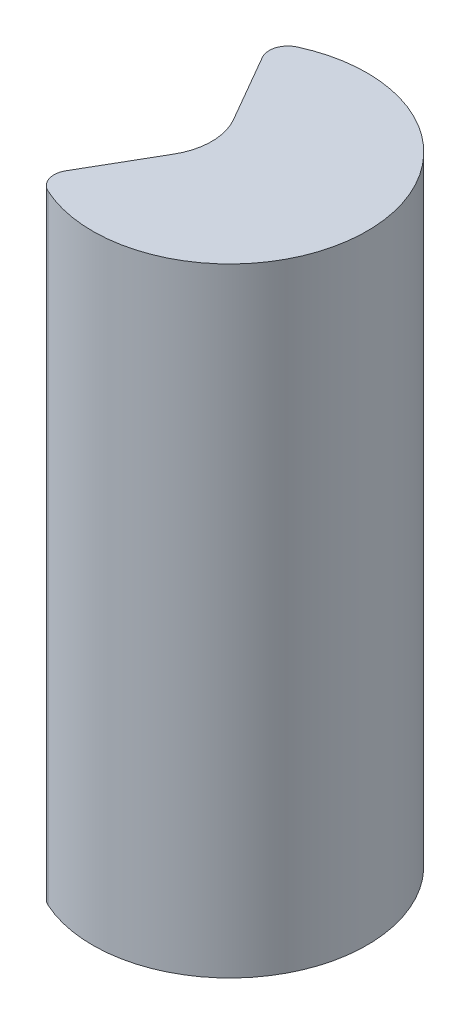
ISO-10303-21;
HEADER;
FILE_DESCRIPTION(('STEP AP214'),'2;1');
FILE_NAME('part.step','',(''),(''),'','','');
FILE_SCHEMA(('AUTOMOTIVE_DESIGN { 1 0 10303 214 1 1 1 1 }'));
ENDSEC;
DATA;
#1=APPLICATION_CONTEXT('core data for automotive mechanical design processes');
#2=APPLICATION_PROTOCOL_DEFINITION('international standard','automotive_design',2000,#1);
#3=PRODUCT_CONTEXT('',#1,'mechanical');
#4=PRODUCT('Part','Part','',(#3));
#5=PRODUCT_RELATED_PRODUCT_CATEGORY('part','',(#4));
#6=PRODUCT_DEFINITION_FORMATION('','',#4);
#7=PRODUCT_DEFINITION_CONTEXT('part definition',#1,'design');
#8=PRODUCT_DEFINITION('design','',#6,#7);
#9=PRODUCT_DEFINITION_SHAPE('','',#8);
#10=(LENGTH_UNIT() NAMED_UNIT(*) SI_UNIT(.MILLI.,.METRE.));
#11=(NAMED_UNIT(*) PLANE_ANGLE_UNIT() SI_UNIT($,.RADIAN.));
#12=(NAMED_UNIT(*) SI_UNIT($,.STERADIAN.) SOLID_ANGLE_UNIT());
#13=UNCERTAINTY_MEASURE_WITH_UNIT(LENGTH_MEASURE(1.E-05),#10,'distance_accuracy_value','');
#14=(GEOMETRIC_REPRESENTATION_CONTEXT(3) GLOBAL_UNCERTAINTY_ASSIGNED_CONTEXT((#13)) GLOBAL_UNIT_ASSIGNED_CONTEXT((#10,
#11,#12)) REPRESENTATION_CONTEXT('',''));
#15=CARTESIAN_POINT('',(0.,0.,0.));
#16=DIRECTION('',(0.,0.,1.));
#17=DIRECTION('',(1.,0.,0.));
#18=AXIS2_PLACEMENT_3D('',#15,#16,#17);
#19=CARTESIAN_POINT('',(-26.3951233930314,330.,57.4241888150511));
#20=DIRECTION('',(0.,-1.,0.));
#21=DIRECTION('',(0.,0.,-1.));
#22=AXIS2_PLACEMENT_3D('',#19,#20,#21);
#23=CYLINDRICAL_SURFACE('',#22,10.);
#24=CARTESIAN_POINT('',(-26.3951233930314,0.,57.4241888150511));
#25=DIRECTION('',(0.,1.,0.));
#26=DIRECTION('',(0.,0.,-1.));
#27=AXIS2_PLACEMENT_3D('',#24,#25,#26);
#28=CIRCLE('',#27,10.);
#29=CARTESIAN_POINT('',(-35.0553774308759,0.,52.4241888150512));
#30=VERTEX_POINT('',#29);
#31=CARTESIAN_POINT('',(-30.5715669678782,0.,66.5102946402175));
#32=VERTEX_POINT('',#31);
#33=EDGE_CURVE('E128',#30,#32,#28,.T.);
#34=ORIENTED_EDGE('',*,*,#33,.T.);
#35=DIRECTION('',(0.,-1.,0.));
#36=VECTOR('',#35,1.);
#37=CARTESIAN_POINT('',(-30.5715669678782,330.,66.5102946402175));
#38=LINE('',#37,#36);
#39=CARTESIAN_POINT('',(-30.5715669678782,330.,66.5102946402175));
#40=VERTEX_POINT('',#39);
#41=EDGE_CURVE('E11',#40,#32,#38,.T.);
#42=ORIENTED_EDGE('',*,*,#41,.F.);
#43=CARTESIAN_POINT('',(-26.3951233930314,330.,57.4241888150511));
#44=DIRECTION('',(0.,1.,0.));
#45=DIRECTION('',(0.,0.,-1.));
#46=AXIS2_PLACEMENT_3D('',#43,#44,#45);
#47=CIRCLE('',#46,10.);
#48=CARTESIAN_POINT('',(-35.0553774308759,330.,52.4241888150512));
#49=VERTEX_POINT('',#48);
#50=EDGE_CURVE('E144',#49,#40,#47,.T.);
#51=ORIENTED_EDGE('',*,*,#50,.F.);
#52=DIRECTION('',(0.,-1.,0.));
#53=VECTOR('',#52,1.);
#54=CARTESIAN_POINT('',(-35.0553774308759,330.,52.4241888150512));
#55=LINE('',#54,#53);
#56=EDGE_CURVE('E124',#49,#30,#55,.T.);
#57=ORIENTED_EDGE('',*,*,#56,.T.);
#58=EDGE_LOOP('',(#34,#42,#51,#57));
#59=FACE_BOUND('',#58,.T.);
#60=ADVANCED_FACE('F39',(#59),#23,.T.);
#61=CARTESIAN_POINT('',(0.,330.,0.));
#62=DIRECTION('',(0.,-1.,0.));
#63=DIRECTION('',(0.,0.,-1.));
#64=AXIS2_PLACEMENT_3D('',#61,#62,#63);
#65=CYLINDRICAL_SURFACE('',#64,73.2);
#66=CARTESIAN_POINT('',(0.,0.,0.));
#67=DIRECTION('',(0.,1.,0.));
#68=DIRECTION('',(0.,0.,1.));
#69=AXIS2_PLACEMENT_3D('',#66,#67,#68);
#70=CIRCLE('',#69,73.2);
#71=CARTESIAN_POINT('',(-30.5715669678788,0.,-66.5102946402172));
#72=VERTEX_POINT('',#71);
#73=EDGE_CURVE('E132',#32,#72,#70,.T.);
#74=ORIENTED_EDGE('',*,*,#73,.T.);
#75=DIRECTION('',(0.,-1.,0.));
#76=VECTOR('',#75,1.);
#77=CARTESIAN_POINT('',(-30.5715669678788,330.,-66.5102946402172));
#78=LINE('',#77,#76);
#79=CARTESIAN_POINT('',(-30.5715669678788,330.,-66.5102946402172));
#80=VERTEX_POINT('',#79);
#81=EDGE_CURVE('E48',#80,#72,#78,.T.);
#82=ORIENTED_EDGE('',*,*,#81,.F.);
#83=CARTESIAN_POINT('',(0.,330.,0.));
#84=DIRECTION('',(0.,1.,0.));
#85=DIRECTION('',(0.,0.,1.));
#86=AXIS2_PLACEMENT_3D('',#83,#84,#85);
#87=CIRCLE('',#86,73.2);
#88=EDGE_CURVE('E93',#40,#80,#87,.T.);
#89=ORIENTED_EDGE('',*,*,#88,.F.);
#90=ORIENTED_EDGE('',*,*,#41,.T.);
#91=EDGE_LOOP('',(#74,#82,#89,#90));
#92=FACE_BOUND('',#91,.T.);
#93=ADVANCED_FACE('F172',(#92),#65,.T.);
#94=CARTESIAN_POINT('',(-26.395123393032,330.,-57.4241888150509));
#95=DIRECTION('',(0.,-1.,0.));
#96=DIRECTION('',(0.,0.,-1.));
#97=AXIS2_PLACEMENT_3D('',#94,#95,#96);
#98=CYLINDRICAL_SURFACE('',#97,10.);
#99=CARTESIAN_POINT('',(-26.395123393032,0.,-57.4241888150509));
#100=DIRECTION('',(0.,1.,0.));
#101=DIRECTION('',(0.,0.,1.));
#102=AXIS2_PLACEMENT_3D('',#99,#100,#101);
#103=CIRCLE('',#102,10.);
#104=CARTESIAN_POINT('',(-35.0553774308764,0.,-52.4241888150508));
#105=VERTEX_POINT('',#104);
#106=EDGE_CURVE('E135',#72,#105,#103,.T.);
#107=ORIENTED_EDGE('',*,*,#106,.T.);
#108=DIRECTION('',(0.,-1.,0.));
#109=VECTOR('',#108,1.);
#110=CARTESIAN_POINT('',(-35.0553774308764,330.,-52.4241888150508));
#111=LINE('',#110,#109);
#112=CARTESIAN_POINT('',(-35.0553774308764,330.,-52.4241888150508));
#113=VERTEX_POINT('',#112);
#114=EDGE_CURVE('E117',#113,#105,#111,.T.);
#115=ORIENTED_EDGE('',*,*,#114,.F.);
#116=CARTESIAN_POINT('',(-26.395123393032,330.,-57.4241888150509));
#117=DIRECTION('',(0.,1.,0.));
#118=DIRECTION('',(0.,0.,1.));
#119=AXIS2_PLACEMENT_3D('',#116,#117,#118);
#120=CIRCLE('',#119,10.);
#121=EDGE_CURVE('E106',#80,#113,#120,.T.);
#122=ORIENTED_EDGE('',*,*,#121,.F.);
#123=ORIENTED_EDGE('',*,*,#81,.T.);
#124=EDGE_LOOP('',(#107,#115,#122,#123));
#125=FACE_BOUND('',#124,.T.);
#126=ADVANCED_FACE('F154',(#125),#98,.T.);
#127=CARTESIAN_POINT('',(-13.9536934298442,330.,-15.8750000000001));
#128=DIRECTION('',(0.866025403784436,0.,-0.500000000000004));
#129=DIRECTION('',(-0.500000000000004,0.,-0.866025403784436));
#130=AXIS2_PLACEMENT_3D('',#127,#128,#129);
#131=PLANE('',#130);
#132=DIRECTION('',(0.500000000000004,0.,0.866025403784436));
#133=VECTOR('',#132,1.);
#134=CARTESIAN_POINT('',(-13.9536934298442,0.,-15.8750000000001));
#135=LINE('',#134,#133);
#136=CARTESIAN_POINT('',(-13.9536934298442,0.,-15.8750000000001));
#137=VERTEX_POINT('',#136);
#138=EDGE_CURVE('E115',#105,#137,#135,.T.);
#139=ORIENTED_EDGE('',*,*,#138,.T.);
#140=DIRECTION('',(0.,-1.,0.));
#141=VECTOR('',#140,1.);
#142=CARTESIAN_POINT('',(-13.9536934298442,330.,-15.8750000000001));
#143=LINE('',#142,#141);
#144=CARTESIAN_POINT('',(-13.9536934298442,330.,-15.8750000000001));
#145=VERTEX_POINT('',#144);
#146=EDGE_CURVE('E112',#145,#137,#143,.T.);
#147=ORIENTED_EDGE('',*,*,#146,.F.);
#148=DIRECTION('',(0.500000000000004,0.,0.866025403784436));
#149=VECTOR('',#148,1.);
#150=CARTESIAN_POINT('',(-13.9536934298442,330.,-15.8750000000001));
#151=LINE('',#150,#149);
#152=EDGE_CURVE('E100',#113,#145,#151,.T.);
#153=ORIENTED_EDGE('',*,*,#152,.F.);
#154=ORIENTED_EDGE('',*,*,#114,.T.);
#155=EDGE_LOOP('',(#139,#147,#153,#154));
#156=FACE_BOUND('',#155,.T.);
#157=ADVANCED_FACE('F113',(#156),#131,.F.);
#158=CARTESIAN_POINT('',(-41.45,330.,0.));
#159=DIRECTION('',(0.,-1.,0.));
#160=DIRECTION('',(0.,0.,-1.));
#161=AXIS2_PLACEMENT_3D('',#158,#159,#160);
#162=CYLINDRICAL_SURFACE('',#161,31.75);
#163=CARTESIAN_POINT('',(-41.45,0.,0.));
#164=DIRECTION('',(0.,-1.,0.));
#165=DIRECTION('',(0.,0.,1.));
#166=AXIS2_PLACEMENT_3D('',#163,#164,#165);
#167=CIRCLE('',#166,31.75);
#168=CARTESIAN_POINT('',(-13.9536934298439,0.,15.8749999999997));
#169=VERTEX_POINT('',#168);
#170=EDGE_CURVE('E79',#137,#169,#167,.T.);
#171=ORIENTED_EDGE('',*,*,#170,.T.);
#172=DIRECTION('',(0.,-1.,0.));
#173=VECTOR('',#172,1.);
#174=CARTESIAN_POINT('',(-13.9536934298439,330.,15.8749999999997));
#175=LINE('',#174,#173);
#176=CARTESIAN_POINT('',(-13.9536934298439,330.,15.8749999999997));
#177=VERTEX_POINT('',#176);
#178=EDGE_CURVE('E118',#177,#169,#175,.T.);
#179=ORIENTED_EDGE('',*,*,#178,.F.);
#180=CARTESIAN_POINT('',(-41.45,330.,0.));
#181=DIRECTION('',(0.,-1.,0.));
#182=DIRECTION('',(0.,0.,1.));
#183=AXIS2_PLACEMENT_3D('',#180,#181,#182);
#184=CIRCLE('',#183,31.75);
#185=EDGE_CURVE('E104',#145,#177,#184,.T.);
#186=ORIENTED_EDGE('',*,*,#185,.F.);
#187=ORIENTED_EDGE('',*,*,#146,.T.);
#188=EDGE_LOOP('',(#171,#179,#186,#187));
#189=FACE_BOUND('',#188,.T.);
#190=ADVANCED_FACE('F120',(#189),#162,.F.);
#191=CARTESIAN_POINT('',(-13.9536934298439,330.,15.8749999999997));
#192=DIRECTION('',(0.866025403784444,0.,0.499999999999991));
#193=DIRECTION('',(0.499999999999991,0.,-0.866025403784444));
#194=AXIS2_PLACEMENT_3D('',#191,#192,#193);
#195=PLANE('',#194);
#196=DIRECTION('',(-0.499999999999991,0.,0.866025403784444));
#197=VECTOR('',#196,1.);
#198=CARTESIAN_POINT('',(-13.9536934298439,0.,15.8749999999997));
#199=LINE('',#198,#197);
#200=EDGE_CURVE('E85',#169,#30,#199,.T.);
#201=ORIENTED_EDGE('',*,*,#200,.T.);
#202=ORIENTED_EDGE('',*,*,#56,.F.);
#203=DIRECTION('',(-0.499999999999991,0.,0.866025403784444));
#204=VECTOR('',#203,1.);
#205=CARTESIAN_POINT('',(-13.9536934298439,330.,15.8749999999997));
#206=LINE('',#205,#204);
#207=EDGE_CURVE('E56',#177,#49,#206,.T.);
#208=ORIENTED_EDGE('',*,*,#207,.F.);
#209=ORIENTED_EDGE('',*,*,#178,.T.);
#210=EDGE_LOOP('',(#201,#202,#208,#209));
#211=FACE_BOUND('',#210,.T.);
#212=ADVANCED_FACE('F161',(#211),#195,.F.);
#213=CARTESIAN_POINT('',(-26.3951233930314,330.,57.4241888150511));
#214=DIRECTION('',(0.,-1.,0.));
#215=DIRECTION('',(0.,0.,-1.));
#216=AXIS2_PLACEMENT_3D('',#213,#214,#215);
#217=PLANE('',#216);
#218=ORIENTED_EDGE('',*,*,#50,.T.);
#219=ORIENTED_EDGE('',*,*,#88,.T.);
#220=ORIENTED_EDGE('',*,*,#121,.T.);
#221=ORIENTED_EDGE('',*,*,#152,.T.);
#222=ORIENTED_EDGE('',*,*,#185,.T.);
#223=ORIENTED_EDGE('',*,*,#207,.T.);
#224=EDGE_LOOP('',(#218,#219,#220,#221,#222,#223));
#225=FACE_BOUND('',#224,.T.);
#226=ADVANCED_FACE('F102',(#225),#217,.F.);
#227=CARTESIAN_POINT('',(-26.3951233930314,0.,57.4241888150511));
#228=DIRECTION('',(0.,-1.,0.));
#229=DIRECTION('',(0.,0.,-1.));
#230=AXIS2_PLACEMENT_3D('',#227,#228,#229);
#231=PLANE('',#230);
#232=ORIENTED_EDGE('',*,*,#33,.F.);
#233=ORIENTED_EDGE('',*,*,#200,.F.);
#234=ORIENTED_EDGE('',*,*,#170,.F.);
#235=ORIENTED_EDGE('',*,*,#138,.F.);
#236=ORIENTED_EDGE('',*,*,#106,.F.);
#237=ORIENTED_EDGE('',*,*,#73,.F.);
#238=EDGE_LOOP('',(#232,#233,#234,#235,#236,#237));
#239=FACE_BOUND('',#238,.T.);
#240=ADVANCED_FACE('F157',(#239),#231,.T.);
#241=CLOSED_SHELL('',(#60,#93,#126,#157,#190,#212,#226,#240));
#242=MANIFOLD_SOLID_BREP('B2',#241);
#243=ADVANCED_BREP_SHAPE_REPRESENTATION('',(#18,#242),#14);
#244=SHAPE_DEFINITION_REPRESENTATION(#9,#243);
ENDSEC;
END-ISO-10303-21;
